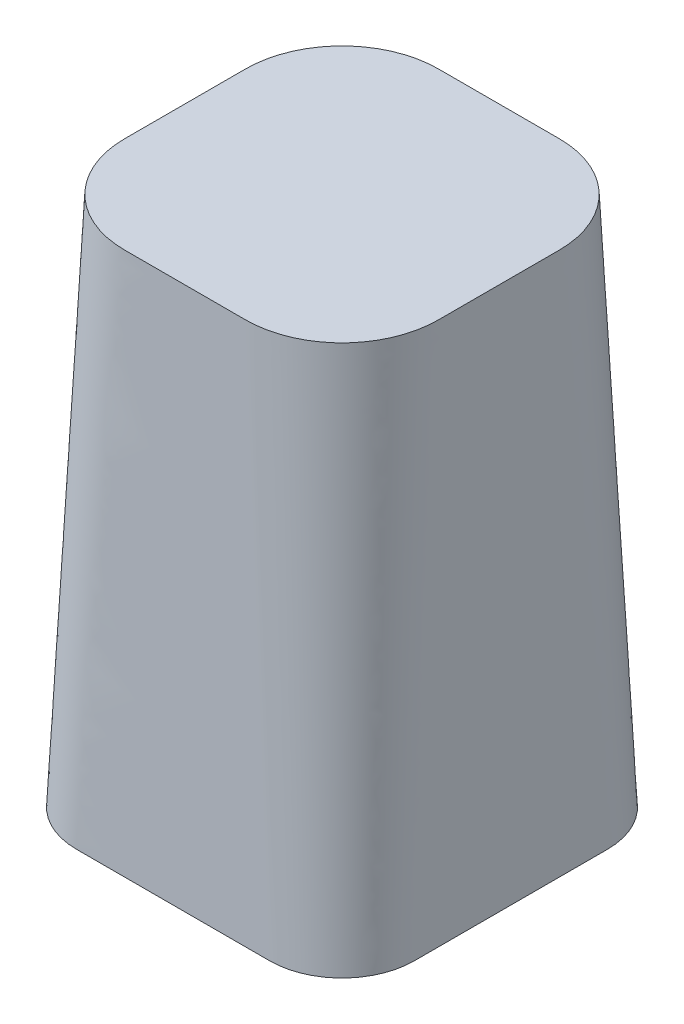
ISO-10303-21;
HEADER;
FILE_DESCRIPTION(('STEP AP214'),'2;1');
FILE_NAME('part.step','',(''),(''),'','','');
FILE_SCHEMA(('AUTOMOTIVE_DESIGN { 1 0 10303 214 1 1 1 1 }'));
ENDSEC;
DATA;
#1=APPLICATION_CONTEXT('core data for automotive mechanical design processes');
#2=APPLICATION_PROTOCOL_DEFINITION('international standard','automotive_design',2000,#1);
#3=PRODUCT_CONTEXT('',#1,'mechanical');
#4=PRODUCT('Part','Part','',(#3));
#5=PRODUCT_RELATED_PRODUCT_CATEGORY('part','',(#4));
#6=PRODUCT_DEFINITION_FORMATION('','',#4);
#7=PRODUCT_DEFINITION_CONTEXT('part definition',#1,'design');
#8=PRODUCT_DEFINITION('design','',#6,#7);
#9=PRODUCT_DEFINITION_SHAPE('','',#8);
#10=(LENGTH_UNIT() NAMED_UNIT(*) SI_UNIT(.MILLI.,.METRE.));
#11=(NAMED_UNIT(*) PLANE_ANGLE_UNIT() SI_UNIT($,.RADIAN.));
#12=(NAMED_UNIT(*) SI_UNIT($,.STERADIAN.) SOLID_ANGLE_UNIT());
#13=UNCERTAINTY_MEASURE_WITH_UNIT(LENGTH_MEASURE(1.E-05),#10,'distance_accuracy_value','');
#14=(GEOMETRIC_REPRESENTATION_CONTEXT(3) GLOBAL_UNCERTAINTY_ASSIGNED_CONTEXT((#13)) GLOBAL_UNIT_ASSIGNED_CONTEXT((#10,
#11,#12)) REPRESENTATION_CONTEXT('',''));
#15=CARTESIAN_POINT('',(0.,0.,0.));
#16=DIRECTION('',(0.,0.,1.));
#17=DIRECTION('',(1.,0.,0.));
#18=AXIS2_PLACEMENT_3D('',#15,#16,#17);
#19=CARTESIAN_POINT('',(-2.5,22.,-2.5));
#20=DIRECTION('',(0.,1.,0.));
#21=DIRECTION('',(0.,0.,1.));
#22=AXIS2_PLACEMENT_3D('',#19,#20,#21);
#23=PLANE('',#22);
#24=CARTESIAN_POINT('',(-2.5,22.,-2.5));
#25=DIRECTION('',(0.,1.,0.));
#26=DIRECTION('',(0.,0.,1.));
#27=AXIS2_PLACEMENT_3D('',#24,#25,#26);
#28=CIRCLE('',#27,4.);
#29=CARTESIAN_POINT('',(-2.49999999999997,22.,-6.5));
#30=VERTEX_POINT('',#29);
#31=CARTESIAN_POINT('',(-6.5,22.,-2.50000000012128));
#32=VERTEX_POINT('',#31);
#33=EDGE_CURVE('E421',#30,#32,#28,.T.);
#34=ORIENTED_EDGE('',*,*,#33,.T.);
#35=DIRECTION('',(0.,0.,1.));
#36=VECTOR('',#35,1.);
#37=CARTESIAN_POINT('',(-6.5,22.,-2.49999999999997));
#38=LINE('',#37,#36);
#39=CARTESIAN_POINT('',(-6.5,22.,2.49999999989919));
#40=VERTEX_POINT('',#39);
#41=EDGE_CURVE('E538',#32,#40,#38,.T.);
#42=ORIENTED_EDGE('',*,*,#41,.T.);
#43=CARTESIAN_POINT('',(-2.5,22.,2.5));
#44=DIRECTION('',(0.,1.,0.));
#45=DIRECTION('',(0.,0.,1.));
#46=AXIS2_PLACEMENT_3D('',#43,#44,#45);
#47=CIRCLE('',#46,4.);
#48=CARTESIAN_POINT('',(-2.50000000012131,22.,6.5));
#49=VERTEX_POINT('',#48);
#50=EDGE_CURVE('E530',#40,#49,#47,.T.);
#51=ORIENTED_EDGE('',*,*,#50,.T.);
#52=DIRECTION('',(1.,0.,0.));
#53=VECTOR('',#52,1.);
#54=CARTESIAN_POINT('',(-2.49999999999997,22.,6.5));
#55=LINE('',#54,#53);
#56=CARTESIAN_POINT('',(2.49999999989907,22.,6.5));
#57=VERTEX_POINT('',#56);
#58=EDGE_CURVE('E518',#49,#57,#55,.T.);
#59=ORIENTED_EDGE('',*,*,#58,.T.);
#60=CARTESIAN_POINT('',(2.5,22.,2.5));
#61=DIRECTION('',(0.,1.,0.));
#62=DIRECTION('',(0.,0.,1.));
#63=AXIS2_PLACEMENT_3D('',#60,#61,#62);
#64=CIRCLE('',#63,4.);
#65=CARTESIAN_POINT('',(6.5,22.,2.50000000012128));
#66=VERTEX_POINT('',#65);
#67=EDGE_CURVE('E512',#57,#66,#64,.T.);
#68=ORIENTED_EDGE('',*,*,#67,.T.);
#69=DIRECTION('',(0.,0.,1.));
#70=VECTOR('',#69,1.);
#71=CARTESIAN_POINT('',(6.5,22.,-2.49999999999997));
#72=LINE('',#71,#70);
#73=CARTESIAN_POINT('',(6.5,22.,-2.49999999989928));
#74=VERTEX_POINT('',#73);
#75=EDGE_CURVE('E504',#74,#66,#72,.T.);
#76=ORIENTED_EDGE('',*,*,#75,.F.);
#77=CARTESIAN_POINT('',(2.5,22.,-2.5));
#78=DIRECTION('',(0.,1.,0.));
#79=DIRECTION('',(0.,0.,1.));
#80=AXIS2_PLACEMENT_3D('',#77,#78,#79);
#81=CIRCLE('',#80,4.);
#82=CARTESIAN_POINT('',(2.49999999999997,22.,-6.5));
#83=VERTEX_POINT('',#82);
#84=EDGE_CURVE('E238',#74,#83,#81,.T.);
#85=ORIENTED_EDGE('',*,*,#84,.T.);
#86=DIRECTION('',(1.,0.,0.));
#87=VECTOR('',#86,1.);
#88=CARTESIAN_POINT('',(-2.49999999999997,22.,-6.5));
#89=LINE('',#88,#87);
#90=EDGE_CURVE('E12',#30,#83,#89,.T.);
#91=ORIENTED_EDGE('',*,*,#90,.F.);
#92=EDGE_LOOP('',(#34,#42,#51,#59,#68,#76,#85,#91));
#93=FACE_BOUND('',#92,.T.);
#94=ADVANCED_FACE('F229',(#93),#23,.T.);
#95=CARTESIAN_POINT('',(-4.,0.,-4.));
#96=DIRECTION('',(0.,1.,0.));
#97=DIRECTION('',(0.,0.,1.));
#98=AXIS2_PLACEMENT_3D('',#95,#96,#97);
#99=PLANE('',#98);
#100=CARTESIAN_POINT('',(-4.,0.,-4.));
#101=DIRECTION('',(0.,1.,0.));
#102=DIRECTION('',(0.,0.,1.));
#103=AXIS2_PLACEMENT_3D('',#100,#101,#102);
#104=CIRCLE('',#103,3.);
#105=CARTESIAN_POINT('',(-3.99999999999998,0.,-7.));
#106=VERTEX_POINT('',#105);
#107=CARTESIAN_POINT('',(-7.,0.,-3.99999999999998));
#108=VERTEX_POINT('',#107);
#109=EDGE_CURVE('E297',#106,#108,#104,.T.);
#110=ORIENTED_EDGE('',*,*,#109,.F.);
#111=DIRECTION('',(1.,0.,0.));
#112=VECTOR('',#111,1.);
#113=CARTESIAN_POINT('',(-3.99999999999998,0.,-7.));
#114=LINE('',#113,#112);
#115=CARTESIAN_POINT('',(3.99999999999998,0.,-7.));
#116=VERTEX_POINT('',#115);
#117=EDGE_CURVE('E313',#106,#116,#114,.T.);
#118=ORIENTED_EDGE('',*,*,#117,.T.);
#119=CARTESIAN_POINT('',(4.,0.,-4.));
#120=DIRECTION('',(0.,1.,0.));
#121=DIRECTION('',(0.,0.,1.));
#122=AXIS2_PLACEMENT_3D('',#119,#120,#121);
#123=CIRCLE('',#122,3.);
#124=CARTESIAN_POINT('',(7.,0.,-3.99999999999998));
#125=VERTEX_POINT('',#124);
#126=EDGE_CURVE('E423',#125,#116,#123,.T.);
#127=ORIENTED_EDGE('',*,*,#126,.F.);
#128=DIRECTION('',(0.,0.,1.));
#129=VECTOR('',#128,1.);
#130=CARTESIAN_POINT('',(7.,0.,-3.99999999999998));
#131=LINE('',#130,#129);
#132=CARTESIAN_POINT('',(7.,0.,3.99999999999998));
#133=VERTEX_POINT('',#132);
#134=EDGE_CURVE('E445',#125,#133,#131,.T.);
#135=ORIENTED_EDGE('',*,*,#134,.T.);
#136=CARTESIAN_POINT('',(4.,0.,4.));
#137=DIRECTION('',(0.,1.,0.));
#138=DIRECTION('',(0.,0.,1.));
#139=AXIS2_PLACEMENT_3D('',#136,#137,#138);
#140=CIRCLE('',#139,3.);
#141=CARTESIAN_POINT('',(3.99999999999998,0.,7.));
#142=VERTEX_POINT('',#141);
#143=EDGE_CURVE('E442',#142,#133,#140,.T.);
#144=ORIENTED_EDGE('',*,*,#143,.F.);
#145=DIRECTION('',(1.,0.,0.));
#146=VECTOR('',#145,1.);
#147=CARTESIAN_POINT('',(-3.99999999999998,0.,7.));
#148=LINE('',#147,#146);
#149=CARTESIAN_POINT('',(-4.,0.,7.));
#150=VERTEX_POINT('',#149);
#151=EDGE_CURVE('E464',#150,#142,#148,.T.);
#152=ORIENTED_EDGE('',*,*,#151,.F.);
#153=CARTESIAN_POINT('',(-4.,0.,4.));
#154=DIRECTION('',(0.,1.,0.));
#155=DIRECTION('',(0.,0.,1.));
#156=AXIS2_PLACEMENT_3D('',#153,#154,#155);
#157=CIRCLE('',#156,3.);
#158=CARTESIAN_POINT('',(-7.,0.,3.99999999999998));
#159=VERTEX_POINT('',#158);
#160=EDGE_CURVE('E301',#159,#150,#157,.T.);
#161=ORIENTED_EDGE('',*,*,#160,.F.);
#162=DIRECTION('',(0.,0.,1.));
#163=VECTOR('',#162,1.);
#164=CARTESIAN_POINT('',(-7.,0.,-3.99999999999998));
#165=LINE('',#164,#163);
#166=EDGE_CURVE('E298',#108,#159,#165,.T.);
#167=ORIENTED_EDGE('',*,*,#166,.F.);
#168=EDGE_LOOP('',(#110,#118,#127,#135,#144,#152,#161,#167));
#169=FACE_BOUND('',#168,.T.);
#170=ADVANCED_FACE('F299',(#169),#99,.F.);
#171=CARTESIAN_POINT('',(-7.,0.,3.99999999888414));
#172=CARTESIAN_POINT('',(-6.5,22.,2.49999999900958));
#173=CARTESIAN_POINT('',(-7.,0.,4.24565509295122));
#174=CARTESIAN_POINT('',(-6.5,22.,2.71803706130278));
#175=CARTESIAN_POINT('',(-6.94248229007872,0.,4.68213361986081));
#176=CARTESIAN_POINT('',(-6.46446460682084,22.,3.17729236908688));
#177=CARTESIAN_POINT('',(-6.75144661720478,0.,5.24004993028035));
#178=CARTESIAN_POINT('',(-6.26894821396644,22.,3.91728509653599));
#179=CARTESIAN_POINT('',(-6.47735910307483,0.,5.7202903912731));
#180=CARTESIAN_POINT('',(-5.89973062877662,22.,4.6654224881863));
#181=CARTESIAN_POINT('',(-6.13259882262915,0.,6.13259882262915));
#182=CARTESIAN_POINT('',(-5.35144270371483,22.,5.35144270371481));
#183=CARTESIAN_POINT('',(-5.72029039127311,0.,6.4773591030748));
#184=CARTESIAN_POINT('',(-4.66542248818633,22.,5.89973062877661));
#185=CARTESIAN_POINT('',(-5.24004993028037,0.,6.75144661720478));
#186=CARTESIAN_POINT('',(-3.91728509653602,22.,6.26894821396642));
#187=CARTESIAN_POINT('',(-4.68213361986083,0.,6.9424822900787));
#188=CARTESIAN_POINT('',(-3.17729236908691,22.,6.46446460682083));
#189=CARTESIAN_POINT('',(-4.24565509295125,0.,7.));
#190=CARTESIAN_POINT('',(-2.71803706130281,22.,6.5));
#191=CARTESIAN_POINT('',(-3.43194444073387,0.,7.));
#192=CARTESIAN_POINT('',(-1.99580868317803,22.,6.5));
#193=CARTESIAN_POINT('',(-2.1862095959251,0.,7.));
#194=CARTESIAN_POINT('',(-1.15220639711316,22.,6.50000000000001));
#195=CARTESIAN_POINT('',(0.,0.,7.));
#196=CARTESIAN_POINT('',(0.,22.,6.49999999999999));
#197=CARTESIAN_POINT('',(2.18620959592508,0.,7.));
#198=CARTESIAN_POINT('',(1.15220639711313,22.,6.50000000000001));
#199=CARTESIAN_POINT('',(3.43194444073385,0.,7.));
#200=CARTESIAN_POINT('',(1.995808683178,22.,6.5));
#201=CARTESIAN_POINT('',(4.24565509295122,0.,7.));
#202=CARTESIAN_POINT('',(2.71803706130278,22.,6.5));
#203=CARTESIAN_POINT('',(4.68213361986081,0.,6.94248229007872));
#204=CARTESIAN_POINT('',(3.17729236908689,22.,6.46446460682084));
#205=CARTESIAN_POINT('',(5.24004993028037,0.,6.75144661720476));
#206=CARTESIAN_POINT('',(3.91728509653599,22.,6.26894821396643));
#207=CARTESIAN_POINT('',(5.7202903912731,0.,6.47735910307484));
#208=CARTESIAN_POINT('',(4.66542248818633,22.,5.89973062877662));
#209=CARTESIAN_POINT('',(6.13259882262915,0.,6.13259882262913));
#210=CARTESIAN_POINT('',(5.3514427037148,22.,5.35144270371481));
#211=CARTESIAN_POINT('',(6.47735910307482,0.,5.72029039127313));
#212=CARTESIAN_POINT('',(5.89973062877663,22.,4.66542248818631));
#213=CARTESIAN_POINT('',(6.75144661720478,0.,5.24004993028034));
#214=CARTESIAN_POINT('',(6.26894821396642,22.,3.917285096536));
#215=CARTESIAN_POINT('',(6.94248229007871,0.,4.68213361986083));
#216=CARTESIAN_POINT('',(6.46446460682084,22.,3.17729236908689));
#217=CARTESIAN_POINT('',(7.,0.,4.24565509295123));
#218=CARTESIAN_POINT('',(6.5,22.,2.71803706130278));
#219=CARTESIAN_POINT('',(7.,0.,3.43194444073385));
#220=CARTESIAN_POINT('',(6.5,22.,1.995808683178));
#221=CARTESIAN_POINT('',(7.,0.,2.18620959592508));
#222=CARTESIAN_POINT('',(6.5,22.,1.15220639711313));
#223=CARTESIAN_POINT('',(6.99999999999999,0.,0.));
#224=CARTESIAN_POINT('',(6.49999999999999,22.0000000000001,0.));
#225=CARTESIAN_POINT('',(7.00000000000001,0.,-2.18620959592508));
#226=CARTESIAN_POINT('',(6.50000000000001,22.,-1.15220639711314));
#227=CARTESIAN_POINT('',(7.,0.,-3.43194444073385));
#228=CARTESIAN_POINT('',(6.5,22.,-1.995808683178));
#229=CARTESIAN_POINT('',(7.,0.,-4.24565509295122));
#230=CARTESIAN_POINT('',(6.5,22.,-2.71803706130279));
#231=CARTESIAN_POINT('',(6.94248229007871,0.,-4.68213361986083));
#232=CARTESIAN_POINT('',(6.46446460682084,22.,-3.17729236908689));
#233=CARTESIAN_POINT('',(6.75144661720478,0.,-5.24004993028035));
#234=CARTESIAN_POINT('',(6.26894821396642,22.,-3.91728509653599));
#235=CARTESIAN_POINT('',(6.47735910307481,0.,-5.72029039127312));
#236=CARTESIAN_POINT('',(5.89973062877662,22.,-4.66542248818632));
#237=CARTESIAN_POINT('',(6.13259882262915,0.,-6.13259882262914));
#238=CARTESIAN_POINT('',(5.35144270371481,22.,-5.35144270371481));
#239=CARTESIAN_POINT('',(5.72029039127311,0.,-6.47735910307482));
#240=CARTESIAN_POINT('',(4.66542248818632,22.,-5.89973062877662));
#241=CARTESIAN_POINT('',(5.24004993028036,0.,-6.75144661720478));
#242=CARTESIAN_POINT('',(3.91728509653599,22.,-6.26894821396643));
#243=CARTESIAN_POINT('',(4.68213361986082,0.,-6.94248229007871));
#244=CARTESIAN_POINT('',(3.1772923690869,22.,-6.46446460682083));
#245=CARTESIAN_POINT('',(4.24565509295123,0.,-7.));
#246=CARTESIAN_POINT('',(2.71803706130279,22.,-6.5));
#247=CARTESIAN_POINT('',(3.43194444073385,0.,-7.));
#248=CARTESIAN_POINT('',(1.995808683178,22.,-6.5));
#249=CARTESIAN_POINT('',(2.18620959592508,0.,-7.00000000000001));
#250=CARTESIAN_POINT('',(1.15220639711314,22.,-6.5));
#251=CARTESIAN_POINT('',(0.,0.,-6.99999999999999));
#252=CARTESIAN_POINT('',(0.,22.,-6.49999999999999));
#253=CARTESIAN_POINT('',(-2.18620959592508,0.,-7.00000000000001));
#254=CARTESIAN_POINT('',(-1.15220639711314,22.,-6.50000000000001));
#255=CARTESIAN_POINT('',(-3.43194444073385,0.,-7.));
#256=CARTESIAN_POINT('',(-1.995808683178,22.,-6.5));
#257=CARTESIAN_POINT('',(-4.24565509295123,0.,-7.));
#258=CARTESIAN_POINT('',(-2.71803706130278,22.,-6.5));
#259=CARTESIAN_POINT('',(-4.68213361986083,0.,-6.94248229007871));
#260=CARTESIAN_POINT('',(-3.17729236908689,22.,-6.46446460682084));
#261=CARTESIAN_POINT('',(-5.24004993028035,0.,-6.75144661720479));
#262=CARTESIAN_POINT('',(-3.91728509653599,22.,-6.26894821396642));
#263=CARTESIAN_POINT('',(-5.72029039127311,0.,-6.4773591030748));
#264=CARTESIAN_POINT('',(-4.66542248818632,22.,-5.89973062877663));
#265=CARTESIAN_POINT('',(-6.13259882262915,0.,-6.13259882262916));
#266=CARTESIAN_POINT('',(-5.35144270371481,22.,-5.3514427037148));
#267=CARTESIAN_POINT('',(-6.47735910307481,0.,-5.7202903912731));
#268=CARTESIAN_POINT('',(-5.89973062877663,22.,-4.66542248818633));
#269=CARTESIAN_POINT('',(-6.75144661720479,0.,-5.24004993028036));
#270=CARTESIAN_POINT('',(-6.26894821396642,22.,-3.91728509653599));
#271=CARTESIAN_POINT('',(-6.94248229007871,0.,-4.68213361986082));
#272=CARTESIAN_POINT('',(-6.46446460682084,22.,-3.17729236908689));
#273=CARTESIAN_POINT('',(-7.,0.,-4.24565509295122));
#274=CARTESIAN_POINT('',(-6.5,22.,-2.71803706130279));
#275=CARTESIAN_POINT('',(-7.,0.,-3.43194444073385));
#276=CARTESIAN_POINT('',(-6.5,22.,-1.995808683178));
#277=CARTESIAN_POINT('',(-7.,0.,-2.18620959592508));
#278=CARTESIAN_POINT('',(-6.5,22.,-1.15220639711313));
#279=CARTESIAN_POINT('',(-7.,0.,0.));
#280=CARTESIAN_POINT('',(-6.5,22.,0.));
#281=CARTESIAN_POINT('',(-7.,0.,2.18620959592507));
#282=CARTESIAN_POINT('',(-6.5,22.,1.15220639711314));
#283=CARTESIAN_POINT('',(-7.,0.,3.43194444073385));
#284=CARTESIAN_POINT('',(-6.5,22.,1.995808683178));
#285=CARTESIAN_POINT('',(-7.,0.,3.99999999888414));
#286=CARTESIAN_POINT('',(-6.5,22.,2.49999999900958));
#287=B_SPLINE_SURFACE_WITH_KNOTS('',3,1,((#171,#172),(#173,#174),(#175,#176),(#177,#178),(#179,
#180),(#181,#182),(#183,#184),(#185,#186),(#187,#188),(#189,#190),(#191,#192),(#193,#194),(#195,
#196),(#197,#198),(#199,#200),(#201,#202),(#203,#204),(#205,#206),(#207,#208),(#209,#210),(#211,
#212),(#213,#214),(#215,#216),(#217,#218),(#219,#220),(#221,#222),(#223,#224),(#225,#226),(#227,
#228),(#229,#230),(#231,#232),(#233,#234),(#235,#236),(#237,#238),(#239,#240),(#241,#242),(#243,
#244),(#245,#246),(#247,#248),(#249,#250),(#251,#252),(#253,#254),(#255,#256),(#257,#258),(#259,
#260),(#261,#262),(#263,#264),(#265,#266),(#267,#268),(#269,#270),(#271,#272),(#273,#274),(#275,
#276),(#277,#278),(#279,#280),(#281,#282),(#283,#284),(#285,#286)),.UNSPECIFIED.,.T.,.F.,.F.,(4,
1,1,1,1,1,1,1,2,1,1,1,2,1,1,1,1,1,1,1,2,1,1,1,2,1,1,1,1,1,1,1,2,1,1,1,2,1,1,1,1,1,1,1,2,1,1,1,
4),(2,2),(0.,0.0144930525015013,0.0289861050030026,0.0434791575045038,0.0579722100060051,
0.0724652625075064,0.0869583150090077,0.101451367510509,0.11594442001201,0.149458315009008,
0.182972210006005,0.216486105003003,0.25,0.264493052501501,0.278986105003003,0.293479157504504,
0.307972210006005,0.322465262507507,0.336958315009008,0.351451367510509,0.365944420012011,
0.399458315009008,0.432972210006005,0.466486105003003,0.5,0.514493052501501,0.528986105003003,
0.543479157504504,0.557972210006005,0.572465262507507,0.586958315009008,0.60145136751051,
0.615944420012011,0.649458315009008,0.682972210006005,0.716486105003003,0.75,0.764493052501501,
0.778986105003003,0.793479157504504,0.807972210006005,0.822465262507507,0.836958315009008,
0.851451367510509,0.865944420012011,0.899458315009008,0.932972210006005,0.966486105003003,1.),
(0.,1.),.UNSPECIFIED.);
#288=CARTESIAN_POINT('',(0.,0.,-6.99999999999999));
#289=CARTESIAN_POINT('',(0.,22.,-6.5));
#290=CARTESIAN_POINT('',(-0.728736531975027,0.,-7.));
#291=CARTESIAN_POINT('',(-0.384068799037713,22.,-6.5));
#292=CARTESIAN_POINT('',(-2.18620959592508,0.,-7.00000000000001));
#293=CARTESIAN_POINT('',(-1.15220639711314,22.,-6.50000000000001));
#294=CARTESIAN_POINT('',(-3.43194444073385,0.,-7.));
#295=CARTESIAN_POINT('',(-1.995808683178,22.,-6.5));
#296=CARTESIAN_POINT('',(-4.24565509295123,0.,-7.));
#297=CARTESIAN_POINT('',(-2.71803706130278,22.,-6.5));
#298=CARTESIAN_POINT('',(-4.68213361986083,0.,-6.94248229007871));
#299=CARTESIAN_POINT('',(-3.17729236908689,22.,-6.46446460682084));
#300=CARTESIAN_POINT('',(-5.24004993028035,0.,-6.75144661720479));
#301=CARTESIAN_POINT('',(-3.91728509653599,22.,-6.26894821396642));
#302=CARTESIAN_POINT('',(-5.72029039127311,0.,-6.4773591030748));
#303=CARTESIAN_POINT('',(-4.66542248818632,22.,-5.89973062877663));
#304=CARTESIAN_POINT('',(-6.13259882262915,0.,-6.13259882262916));
#305=CARTESIAN_POINT('',(-5.35144270371481,22.,-5.3514427037148));
#306=CARTESIAN_POINT('',(-6.47735910307481,0.,-5.7202903912731));
#307=CARTESIAN_POINT('',(-5.89973062877663,22.,-4.66542248818633));
#308=CARTESIAN_POINT('',(-6.75144661720479,0.,-5.24004993028036));
#309=CARTESIAN_POINT('',(-6.26894821396642,22.,-3.91728509653599));
#310=CARTESIAN_POINT('',(-6.94248229007871,0.,-4.68213361986082));
#311=CARTESIAN_POINT('',(-6.46446460682084,22.,-3.17729236908689));
#312=CARTESIAN_POINT('',(-7.,0.,-4.24565509295122));
#313=CARTESIAN_POINT('',(-6.5,22.,-2.71803706130279));
#314=CARTESIAN_POINT('',(-7.,0.,-3.43194444073385));
#315=CARTESIAN_POINT('',(-6.5,22.,-1.995808683178));
#316=CARTESIAN_POINT('',(-7.,0.,-2.18620959592508));
#317=CARTESIAN_POINT('',(-6.5,22.,-1.15220639711313));
#318=CARTESIAN_POINT('',(-7.,0.,0.));
#319=CARTESIAN_POINT('',(-6.5,22.,0.));
#320=CARTESIAN_POINT('',(-7.,0.,2.18620959592507));
#321=CARTESIAN_POINT('',(-6.5,22.,1.15220639711314));
#322=CARTESIAN_POINT('',(-7.,0.,3.43194444073385));
#323=CARTESIAN_POINT('',(-6.5,22.,1.995808683178));
#324=CARTESIAN_POINT('',(-7.,0.,4.24565509295122));
#325=CARTESIAN_POINT('',(-6.5,22.,2.71803706130278));
#326=CARTESIAN_POINT('',(-6.94248229007872,0.,4.68213361986081));
#327=CARTESIAN_POINT('',(-6.46446460682084,22.,3.17729236908688));
#328=CARTESIAN_POINT('',(-6.75144661720478,0.,5.24004993028035));
#329=CARTESIAN_POINT('',(-6.26894821396644,22.,3.91728509653599));
#330=CARTESIAN_POINT('',(-6.47735910307483,0.,5.7202903912731));
#331=CARTESIAN_POINT('',(-5.89973062877662,22.,4.6654224881863));
#332=CARTESIAN_POINT('',(-6.13259882262915,0.,6.13259882262915));
#333=CARTESIAN_POINT('',(-5.35144270371483,22.,5.35144270371481));
#334=CARTESIAN_POINT('',(-5.72029039127311,0.,6.4773591030748));
#335=CARTESIAN_POINT('',(-4.66542248818633,22.,5.89973062877661));
#336=CARTESIAN_POINT('',(-5.24004993028037,0.,6.75144661720478));
#337=CARTESIAN_POINT('',(-3.91728509653602,22.,6.26894821396642));
#338=CARTESIAN_POINT('',(-4.68213361986083,0.,6.9424822900787));
#339=CARTESIAN_POINT('',(-3.17729236908691,22.,6.46446460682083));
#340=CARTESIAN_POINT('',(-4.24565509295125,0.,7.));
#341=CARTESIAN_POINT('',(-2.71803706130281,22.,6.5));
#342=CARTESIAN_POINT('',(-3.43194444073387,0.,7.));
#343=CARTESIAN_POINT('',(-1.99580868317803,22.,6.5));
#344=CARTESIAN_POINT('',(-2.1862095959251,0.,7.));
#345=CARTESIAN_POINT('',(-1.15220639711316,22.,6.50000000000001));
#346=CARTESIAN_POINT('',(0.,0.,7.));
#347=CARTESIAN_POINT('',(0.,22.,6.49999999999999));
#348=CARTESIAN_POINT('',(2.18620959592508,0.,7.));
#349=CARTESIAN_POINT('',(1.15220639711313,22.,6.50000000000001));
#350=CARTESIAN_POINT('',(3.43194444073385,0.,7.));
#351=CARTESIAN_POINT('',(1.995808683178,22.,6.5));
#352=CARTESIAN_POINT('',(4.24565509295122,0.,7.));
#353=CARTESIAN_POINT('',(2.71803706130278,22.,6.5));
#354=CARTESIAN_POINT('',(4.68213361986081,0.,6.94248229007872));
#355=CARTESIAN_POINT('',(3.17729236908689,22.,6.46446460682084));
#356=CARTESIAN_POINT('',(5.24004993028037,0.,6.75144661720476));
#357=CARTESIAN_POINT('',(3.91728509653599,22.,6.26894821396643));
#358=CARTESIAN_POINT('',(5.7202903912731,0.,6.47735910307484));
#359=CARTESIAN_POINT('',(4.66542248818633,22.,5.89973062877662));
#360=CARTESIAN_POINT('',(6.13259882262915,0.,6.13259882262913));
#361=CARTESIAN_POINT('',(5.3514427037148,22.,5.35144270371481));
#362=CARTESIAN_POINT('',(6.47735910307482,0.,5.72029039127313));
#363=CARTESIAN_POINT('',(5.89973062877663,22.,4.66542248818631));
#364=CARTESIAN_POINT('',(6.75144661720478,0.,5.24004993028034));
#365=CARTESIAN_POINT('',(6.26894821396642,22.,3.917285096536));
#366=CARTESIAN_POINT('',(6.94248229007871,0.,4.68213361986083));
#367=CARTESIAN_POINT('',(6.46446460682084,22.,3.17729236908689));
#368=CARTESIAN_POINT('',(7.,0.,4.24565509295123));
#369=CARTESIAN_POINT('',(6.5,22.,2.71803706130278));
#370=CARTESIAN_POINT('',(7.,0.,3.43194444073385));
#371=CARTESIAN_POINT('',(6.5,22.,1.995808683178));
#372=CARTESIAN_POINT('',(7.,0.,2.18620959592508));
#373=CARTESIAN_POINT('',(6.5,22.,1.15220639711313));
#374=CARTESIAN_POINT('',(6.99999999999999,0.,0.));
#375=CARTESIAN_POINT('',(6.49999999999999,22.0000000000001,0.));
#376=CARTESIAN_POINT('',(7.00000000000001,0.,-2.18620959592508));
#377=CARTESIAN_POINT('',(6.50000000000001,22.,-1.15220639711314));
#378=CARTESIAN_POINT('',(7.,0.,-3.43194444073385));
#379=CARTESIAN_POINT('',(6.5,22.,-1.995808683178));
#380=CARTESIAN_POINT('',(7.,0.,-4.24565509295122));
#381=CARTESIAN_POINT('',(6.5,22.,-2.71803706130279));
#382=CARTESIAN_POINT('',(6.94248229007871,0.,-4.68213361986083));
#383=CARTESIAN_POINT('',(6.46446460682084,22.,-3.17729236908689));
#384=CARTESIAN_POINT('',(6.75144661720478,0.,-5.24004993028035));
#385=CARTESIAN_POINT('',(6.26894821396642,22.,-3.91728509653599));
#386=CARTESIAN_POINT('',(6.47735910307481,0.,-5.72029039127312));
#387=CARTESIAN_POINT('',(5.89973062877662,22.,-4.66542248818632));
#388=CARTESIAN_POINT('',(6.13259882262915,0.,-6.13259882262914));
#389=CARTESIAN_POINT('',(5.35144270371481,22.,-5.35144270371481));
#390=CARTESIAN_POINT('',(5.72029039127311,0.,-6.47735910307482));
#391=CARTESIAN_POINT('',(4.66542248818632,22.,-5.89973062877662));
#392=CARTESIAN_POINT('',(5.24004993028036,0.,-6.75144661720478));
#393=CARTESIAN_POINT('',(3.91728509653599,22.,-6.26894821396643));
#394=CARTESIAN_POINT('',(4.68213361986082,0.,-6.94248229007871));
#395=CARTESIAN_POINT('',(3.1772923690869,22.,-6.46446460682083));
#396=CARTESIAN_POINT('',(4.24565509295123,0.,-7.));
#397=CARTESIAN_POINT('',(2.71803706130279,22.,-6.5));
#398=CARTESIAN_POINT('',(3.43194444073385,0.,-7.));
#399=CARTESIAN_POINT('',(1.995808683178,22.,-6.5));
#400=CARTESIAN_POINT('',(2.18620959592508,0.,-7.00000000000001));
#401=CARTESIAN_POINT('',(1.15220639711314,22.,-6.5));
#402=CARTESIAN_POINT('',(0.728736531975026,0.,-6.99999999999999));
#403=CARTESIAN_POINT('',(0.384068799037711,22.,-6.5));
#404=CARTESIAN_POINT('',(0.,0.,-6.99999999999999));
#405=CARTESIAN_POINT('',(0.,22.,-6.5));
#406=B_SPLINE_SURFACE_WITH_KNOTS('',3,1,((#288,#289),(#290,#291),(#292,#293),(#294,#295),(#296,
#297),(#298,#299),(#300,#301),(#302,#303),(#304,#305),(#306,#307),(#308,#309),(#310,#311),(#312,
#313),(#314,#315),(#316,#317),(#318,#319),(#320,#321),(#322,#323),(#324,#325),(#326,#327),(#328,
#329),(#330,#331),(#332,#333),(#334,#335),(#336,#337),(#338,#339),(#340,#341),(#342,#343),(#344,
#345),(#346,#347),(#348,#349),(#350,#351),(#352,#353),(#354,#355),(#356,#357),(#358,#359),(#360,
#361),(#362,#363),(#364,#365),(#366,#367),(#368,#369),(#370,#371),(#372,#373),(#374,#375),(#376,
#377),(#378,#379),(#380,#381),(#382,#383),(#384,#385),(#386,#387),(#388,#389),(#390,#391),(#392,
#393),(#394,#395),(#396,#397),(#398,#399),(#400,#401),(#402,#403),(#404,#405)),.UNSPECIFIED.,
.T.,.F.,.F.,(4,1,2,1,1,1,1,1,1,1,2,1,1,1,2,1,1,1,1,1,1,1,2,1,1,1,2,1,1,1,1,1,1,1,2,1,1,1,2,1,1,
1,1,1,1,1,2,1,4),(2,2),(0.682972210006005,0.716486105003003,0.75,0.764493052501501,
0.778986105003003,0.793479157504504,0.807972210006005,0.822465262507507,0.836958315009008,
0.851451367510509,0.865944420012011,0.899458315009008,0.932972210006005,0.966486105003003,1.,
1.0144930525015,1.028986105003,1.0434791575045,1.05797221000601,1.07246526250751,
1.08695831500901,1.10145136751051,1.11594442001201,1.14945831500901,1.18297221000601,
1.216486105003,1.25,1.2644930525015,1.278986105003,1.2934791575045,1.30797221000601,
1.32246526250751,1.33695831500901,1.35145136751051,1.36594442001201,1.39945831500901,
1.43297221000601,1.466486105003,1.5,1.5144930525015,1.528986105003,1.5434791575045,
1.55797221000601,1.57246526250751,1.58695831500901,1.60145136751051,1.61594442001201,
1.64945831500901,1.68297221000601),(0.,1.),.UNSPECIFIED.);
#407=ORIENTED_EDGE('',*,*,#109,.T.);
#408=ORIENTED_EDGE('',*,*,#166,.T.);
#409=ORIENTED_EDGE('',*,*,#160,.T.);
#410=ORIENTED_EDGE('',*,*,#151,.T.);
#411=ORIENTED_EDGE('',*,*,#143,.T.);
#412=ORIENTED_EDGE('',*,*,#134,.F.);
#413=ORIENTED_EDGE('',*,*,#126,.T.);
#414=ORIENTED_EDGE('',*,*,#117,.F.);
#415=EDGE_LOOP('',(#407,#408,#409,#410,#411,#412,#413,#414));
#416=FACE_BOUND('',#415,.T.);
#417=ORIENTED_EDGE('',*,*,#90,.T.);
#418=ORIENTED_EDGE('',*,*,#84,.F.);
#419=ORIENTED_EDGE('',*,*,#75,.T.);
#420=ORIENTED_EDGE('',*,*,#67,.F.);
#421=ORIENTED_EDGE('',*,*,#58,.F.);
#422=ORIENTED_EDGE('',*,*,#50,.F.);
#423=ORIENTED_EDGE('',*,*,#41,.F.);
#424=ORIENTED_EDGE('',*,*,#33,.F.);
#425=EDGE_LOOP('',(#417,#418,#419,#420,#421,#422,#423,#424));
#426=FACE_BOUND('',#425,.T.);
#427=ADVANCED_FACE('F311',(#416,#426),#406,.T.);
#428=CLOSED_SHELL('',(#94,#170,#427));
#429=MANIFOLD_SOLID_BREP('B2',#428);
#430=ADVANCED_BREP_SHAPE_REPRESENTATION('',(#18,#429),#14);
#431=SHAPE_DEFINITION_REPRESENTATION(#9,#430);
ENDSEC;
END-ISO-10303-21;
